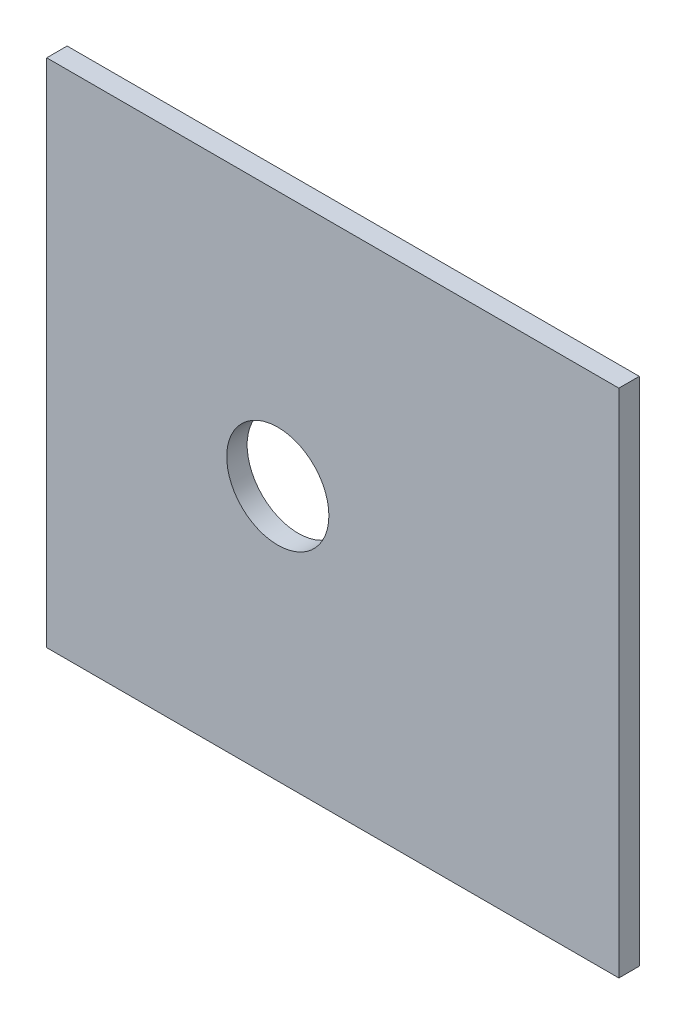
ISO-10303-21;
HEADER;
FILE_DESCRIPTION(('STEP AP214'),'2;1');
FILE_NAME('part.step','',(''),(''),'','','');
FILE_SCHEMA(('AUTOMOTIVE_DESIGN { 1 0 10303 214 1 1 1 1 }'));
ENDSEC;
DATA;
#1=APPLICATION_CONTEXT('core data for automotive mechanical design processes');
#2=APPLICATION_PROTOCOL_DEFINITION('international standard','automotive_design',2000,#1);
#3=PRODUCT_CONTEXT('',#1,'mechanical');
#4=PRODUCT('Part','Part','',(#3));
#5=PRODUCT_RELATED_PRODUCT_CATEGORY('part','',(#4));
#6=PRODUCT_DEFINITION_FORMATION('','',#4);
#7=PRODUCT_DEFINITION_CONTEXT('part definition',#1,'design');
#8=PRODUCT_DEFINITION('design','',#6,#7);
#9=PRODUCT_DEFINITION_SHAPE('','',#8);
#10=(LENGTH_UNIT() NAMED_UNIT(*) SI_UNIT(.MILLI.,.METRE.));
#11=(NAMED_UNIT(*) PLANE_ANGLE_UNIT() SI_UNIT($,.RADIAN.));
#12=(NAMED_UNIT(*) SI_UNIT($,.STERADIAN.) SOLID_ANGLE_UNIT());
#13=UNCERTAINTY_MEASURE_WITH_UNIT(LENGTH_MEASURE(1.E-05),#10,'distance_accuracy_value','');
#14=(GEOMETRIC_REPRESENTATION_CONTEXT(3) GLOBAL_UNCERTAINTY_ASSIGNED_CONTEXT((#13)) GLOBAL_UNIT_ASSIGNED_CONTEXT((#10,
#11,#12)) REPRESENTATION_CONTEXT('',''));
#15=CARTESIAN_POINT('',(0.,0.,0.));
#16=DIRECTION('',(0.,0.,1.));
#17=DIRECTION('',(1.,0.,0.));
#18=AXIS2_PLACEMENT_3D('',#15,#16,#17);
#19=CARTESIAN_POINT('',(0.,0.,4.));
#20=DIRECTION('',(0.,0.,-1.));
#21=DIRECTION('',(-1.,0.,0.));
#22=AXIS2_PLACEMENT_3D('',#19,#20,#21);
#23=PLANE('',#22);
#24=DIRECTION('',(0.,1.,0.));
#25=VECTOR('',#24,1.);
#26=CARTESIAN_POINT('',(56.,-50.,4.));
#27=LINE('',#26,#25);
#28=CARTESIAN_POINT('',(56.,-50.,4.));
#29=VERTEX_POINT('',#28);
#30=CARTESIAN_POINT('',(56.,50.,4.));
#31=VERTEX_POINT('',#30);
#32=EDGE_CURVE('E85',#29,#31,#27,.T.);
#33=ORIENTED_EDGE('',*,*,#32,.T.);
#34=DIRECTION('',(-1.,0.,0.));
#35=VECTOR('',#34,1.);
#36=CARTESIAN_POINT('',(-56.,50.,4.));
#37=LINE('',#36,#35);
#38=CARTESIAN_POINT('',(-56.,50.,4.));
#39=VERTEX_POINT('',#38);
#40=EDGE_CURVE('E80',#31,#39,#37,.T.);
#41=ORIENTED_EDGE('',*,*,#40,.T.);
#42=DIRECTION('',(0.,-1.,0.));
#43=VECTOR('',#42,1.);
#44=CARTESIAN_POINT('',(-56.,-50.,4.));
#45=LINE('',#44,#43);
#46=CARTESIAN_POINT('',(-56.,-50.,4.));
#47=VERTEX_POINT('',#46);
#48=EDGE_CURVE('E83',#39,#47,#45,.T.);
#49=ORIENTED_EDGE('',*,*,#48,.T.);
#50=DIRECTION('',(1.,0.,0.));
#51=VECTOR('',#50,1.);
#52=CARTESIAN_POINT('',(-56.,-50.,4.));
#53=LINE('',#52,#51);
#54=EDGE_CURVE('E50',#47,#29,#53,.T.);
#55=ORIENTED_EDGE('',*,*,#54,.T.);
#56=EDGE_LOOP('',(#33,#41,#49,#55));
#57=FACE_BOUND('',#56,.T.);
#58=CARTESIAN_POINT('',(-10.7633755752213,0.,4.));
#59=DIRECTION('',(0.,0.,1.));
#60=DIRECTION('',(1.,0.,0.));
#61=AXIS2_PLACEMENT_3D('',#58,#59,#60);
#62=CIRCLE('',#61,10.);
#63=CARTESIAN_POINT('',(-0.763375575221251,0.,4.));
#64=VERTEX_POINT('',#63);
#65=EDGE_CURVE('E100',#64,#64,#62,.T.);
#66=ORIENTED_EDGE('',*,*,#65,.F.);
#67=EDGE_LOOP('',(#66));
#68=FACE_BOUND('',#67,.T.);
#69=ADVANCED_FACE('F33',(#57,#68),#23,.F.);
#70=CARTESIAN_POINT('',(0.,0.,0.));
#71=DIRECTION('',(0.,0.,-1.));
#72=DIRECTION('',(-1.,0.,0.));
#73=AXIS2_PLACEMENT_3D('',#70,#71,#72);
#74=PLANE('',#73);
#75=DIRECTION('',(0.,1.,0.));
#76=VECTOR('',#75,1.);
#77=CARTESIAN_POINT('',(56.,-50.,0.));
#78=LINE('',#77,#76);
#79=CARTESIAN_POINT('',(56.,-50.,0.));
#80=VERTEX_POINT('',#79);
#81=CARTESIAN_POINT('',(56.,50.,0.));
#82=VERTEX_POINT('',#81);
#83=EDGE_CURVE('E97',#80,#82,#78,.T.);
#84=ORIENTED_EDGE('',*,*,#83,.F.);
#85=DIRECTION('',(1.,0.,0.));
#86=VECTOR('',#85,1.);
#87=CARTESIAN_POINT('',(-56.,-50.,0.));
#88=LINE('',#87,#86);
#89=CARTESIAN_POINT('',(-56.,-50.,0.));
#90=VERTEX_POINT('',#89);
#91=EDGE_CURVE('E73',#90,#80,#88,.T.);
#92=ORIENTED_EDGE('',*,*,#91,.F.);
#93=DIRECTION('',(0.,-1.,0.));
#94=VECTOR('',#93,1.);
#95=CARTESIAN_POINT('',(-56.,-50.,0.));
#96=LINE('',#95,#94);
#97=CARTESIAN_POINT('',(-56.,50.,0.));
#98=VERTEX_POINT('',#97);
#99=EDGE_CURVE('E67',#98,#90,#96,.T.);
#100=ORIENTED_EDGE('',*,*,#99,.F.);
#101=DIRECTION('',(-1.,0.,0.));
#102=VECTOR('',#101,1.);
#103=CARTESIAN_POINT('',(-56.,50.,0.));
#104=LINE('',#103,#102);
#105=EDGE_CURVE('E89',#82,#98,#104,.T.);
#106=ORIENTED_EDGE('',*,*,#105,.F.);
#107=EDGE_LOOP('',(#84,#92,#100,#106));
#108=FACE_BOUND('',#107,.T.);
#109=CARTESIAN_POINT('',(-10.7633755752213,0.,0.));
#110=DIRECTION('',(0.,0.,1.));
#111=DIRECTION('',(1.,0.,0.));
#112=AXIS2_PLACEMENT_3D('',#109,#110,#111);
#113=CIRCLE('',#112,10.);
#114=CARTESIAN_POINT('',(-0.763375575221251,0.,0.));
#115=VERTEX_POINT('',#114);
#116=EDGE_CURVE('E112',#115,#115,#113,.T.);
#117=ORIENTED_EDGE('',*,*,#116,.T.);
#118=EDGE_LOOP('',(#117));
#119=FACE_BOUND('',#118,.T.);
#120=ADVANCED_FACE('F108',(#108,#119),#74,.T.);
#121=CARTESIAN_POINT('',(56.,-50.,4.));
#122=DIRECTION('',(-1.,0.,0.));
#123=DIRECTION('',(0.,0.,1.));
#124=AXIS2_PLACEMENT_3D('',#121,#122,#123);
#125=PLANE('',#124);
#126=ORIENTED_EDGE('',*,*,#83,.T.);
#127=DIRECTION('',(0.,0.,-1.));
#128=VECTOR('',#127,1.);
#129=CARTESIAN_POINT('',(56.,50.,4.));
#130=LINE('',#129,#128);
#131=EDGE_CURVE('E11',#31,#82,#130,.T.);
#132=ORIENTED_EDGE('',*,*,#131,.F.);
#133=ORIENTED_EDGE('',*,*,#32,.F.);
#134=DIRECTION('',(0.,0.,-1.));
#135=VECTOR('',#134,1.);
#136=CARTESIAN_POINT('',(56.,-50.,4.));
#137=LINE('',#136,#135);
#138=EDGE_CURVE('E93',#29,#80,#137,.T.);
#139=ORIENTED_EDGE('',*,*,#138,.T.);
#140=EDGE_LOOP('',(#126,#132,#133,#139));
#141=FACE_BOUND('',#140,.T.);
#142=ADVANCED_FACE('F35',(#141),#125,.F.);
#143=CARTESIAN_POINT('',(-56.,50.,4.));
#144=DIRECTION('',(0.,-1.,0.));
#145=DIRECTION('',(0.,0.,-1.));
#146=AXIS2_PLACEMENT_3D('',#143,#144,#145);
#147=PLANE('',#146);
#148=ORIENTED_EDGE('',*,*,#105,.T.);
#149=DIRECTION('',(0.,0.,-1.));
#150=VECTOR('',#149,1.);
#151=CARTESIAN_POINT('',(-56.,50.,4.));
#152=LINE('',#151,#150);
#153=EDGE_CURVE('E42',#39,#98,#152,.T.);
#154=ORIENTED_EDGE('',*,*,#153,.F.);
#155=ORIENTED_EDGE('',*,*,#40,.F.);
#156=ORIENTED_EDGE('',*,*,#131,.T.);
#157=EDGE_LOOP('',(#148,#154,#155,#156));
#158=FACE_BOUND('',#157,.T.);
#159=ADVANCED_FACE('F88',(#158),#147,.F.);
#160=CARTESIAN_POINT('',(-56.,-50.,4.));
#161=DIRECTION('',(1.,0.,0.));
#162=DIRECTION('',(0.,0.,-1.));
#163=AXIS2_PLACEMENT_3D('',#160,#161,#162);
#164=PLANE('',#163);
#165=ORIENTED_EDGE('',*,*,#99,.T.);
#166=DIRECTION('',(0.,0.,-1.));
#167=VECTOR('',#166,1.);
#168=CARTESIAN_POINT('',(-56.,-50.,4.));
#169=LINE('',#168,#167);
#170=EDGE_CURVE('E90',#47,#90,#169,.T.);
#171=ORIENTED_EDGE('',*,*,#170,.F.);
#172=ORIENTED_EDGE('',*,*,#48,.F.);
#173=ORIENTED_EDGE('',*,*,#153,.T.);
#174=EDGE_LOOP('',(#165,#171,#172,#173));
#175=FACE_BOUND('',#174,.T.);
#176=ADVANCED_FACE('F91',(#175),#164,.F.);
#177=CARTESIAN_POINT('',(-56.,-50.,4.));
#178=DIRECTION('',(0.,1.,0.));
#179=DIRECTION('',(0.,0.,1.));
#180=AXIS2_PLACEMENT_3D('',#177,#178,#179);
#181=PLANE('',#180);
#182=ORIENTED_EDGE('',*,*,#91,.T.);
#183=ORIENTED_EDGE('',*,*,#138,.F.);
#184=ORIENTED_EDGE('',*,*,#54,.F.);
#185=ORIENTED_EDGE('',*,*,#170,.T.);
#186=EDGE_LOOP('',(#182,#183,#184,#185));
#187=FACE_BOUND('',#186,.T.);
#188=ADVANCED_FACE('F105',(#187),#181,.F.);
#189=CARTESIAN_POINT('',(-10.7633755752213,0.,4.));
#190=DIRECTION('',(0.,0.,-1.));
#191=DIRECTION('',(-1.,0.,0.));
#192=AXIS2_PLACEMENT_3D('',#189,#190,#191);
#193=CYLINDRICAL_SURFACE('',#192,10.);
#194=ORIENTED_EDGE('',*,*,#65,.T.);
#195=EDGE_LOOP('',(#194));
#196=FACE_BOUND('',#195,.T.);
#197=ORIENTED_EDGE('',*,*,#116,.F.);
#198=EDGE_LOOP('',(#197));
#199=FACE_BOUND('',#198,.T.);
#200=ADVANCED_FACE('F118',(#196,#199),#193,.F.);
#201=CLOSED_SHELL('',(#69,#120,#142,#159,#176,#188,#200));
#202=MANIFOLD_SOLID_BREP('B2',#201);
#203=ADVANCED_BREP_SHAPE_REPRESENTATION('',(#18,#202),#14);
#204=SHAPE_DEFINITION_REPRESENTATION(#9,#203);
ENDSEC;
END-ISO-10303-21;
